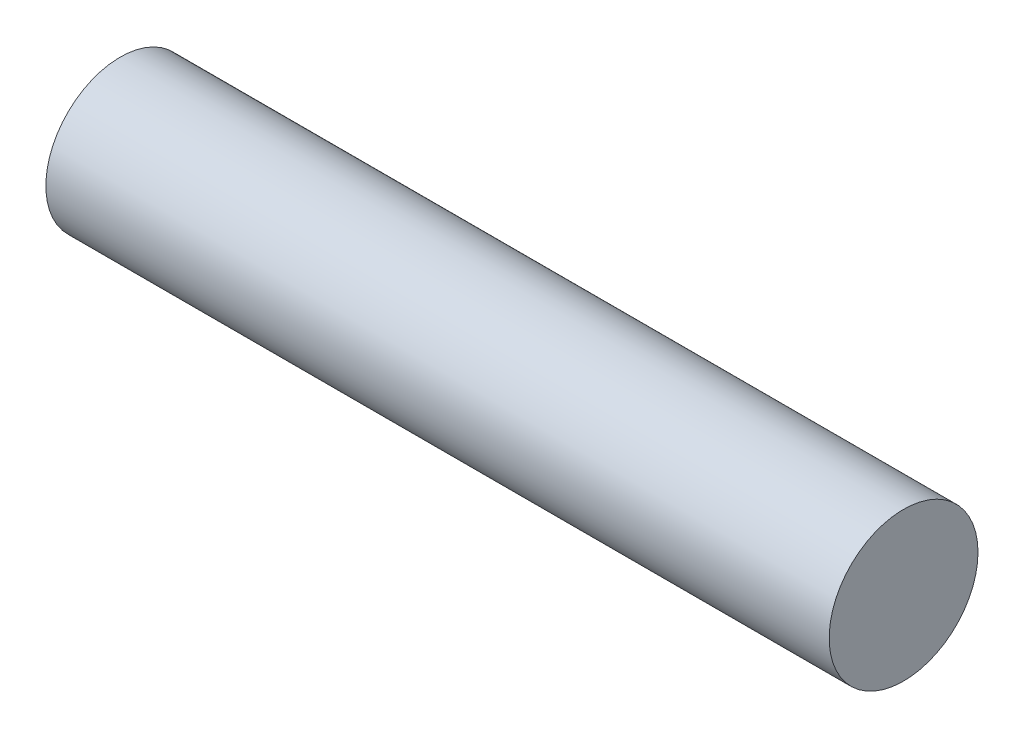
ISO-10303-21;
HEADER;
FILE_DESCRIPTION(('STEP AP214'),'2;1');
FILE_NAME('part.step','',(''),(''),'','','');
FILE_SCHEMA(('AUTOMOTIVE_DESIGN { 1 0 10303 214 1 1 1 1 }'));
ENDSEC;
DATA;
#1=APPLICATION_CONTEXT('core data for automotive mechanical design processes');
#2=APPLICATION_PROTOCOL_DEFINITION('international standard','automotive_design',2000,#1);
#3=PRODUCT_CONTEXT('',#1,'mechanical');
#4=PRODUCT('Part','Part','',(#3));
#5=PRODUCT_RELATED_PRODUCT_CATEGORY('part','',(#4));
#6=PRODUCT_DEFINITION_FORMATION('','',#4);
#7=PRODUCT_DEFINITION_CONTEXT('part definition',#1,'design');
#8=PRODUCT_DEFINITION('design','',#6,#7);
#9=PRODUCT_DEFINITION_SHAPE('','',#8);
#10=(LENGTH_UNIT() NAMED_UNIT(*) SI_UNIT(.MILLI.,.METRE.));
#11=(NAMED_UNIT(*) PLANE_ANGLE_UNIT() SI_UNIT($,.RADIAN.));
#12=(NAMED_UNIT(*) SI_UNIT($,.STERADIAN.) SOLID_ANGLE_UNIT());
#13=UNCERTAINTY_MEASURE_WITH_UNIT(LENGTH_MEASURE(1.E-05),#10,'distance_accuracy_value','');
#14=(GEOMETRIC_REPRESENTATION_CONTEXT(3) GLOBAL_UNCERTAINTY_ASSIGNED_CONTEXT((#13)) GLOBAL_UNIT_ASSIGNED_CONTEXT((#10,
#11,#12)) REPRESENTATION_CONTEXT('',''));
#15=CARTESIAN_POINT('',(0.,0.,0.));
#16=DIRECTION('',(0.,0.,1.));
#17=DIRECTION('',(1.,0.,0.));
#18=AXIS2_PLACEMENT_3D('',#15,#16,#17);
#19=CARTESIAN_POINT('',(58.,-9.,-28.));
#20=DIRECTION('',(-1.,0.,0.));
#21=DIRECTION('',(0.,0.,1.));
#22=AXIS2_PLACEMENT_3D('',#19,#20,#21);
#23=CYLINDRICAL_SURFACE('',#22,4.);
#24=CARTESIAN_POINT('',(58.,-9.,-28.));
#25=DIRECTION('',(1.,0.,0.));
#26=DIRECTION('',(0.,0.,-1.));
#27=AXIS2_PLACEMENT_3D('',#24,#25,#26);
#28=CIRCLE('',#27,4.);
#29=CARTESIAN_POINT('',(58.,-9.,-32.));
#30=VERTEX_POINT('',#29);
#31=EDGE_CURVE('E10',#30,#30,#28,.T.);
#32=ORIENTED_EDGE('',*,*,#31,.F.);
#33=EDGE_LOOP('',(#32));
#34=FACE_BOUND('',#33,.T.);
#35=CARTESIAN_POINT('',(15.9,-9.,-28.));
#36=DIRECTION('',(1.,0.,0.));
#37=DIRECTION('',(0.,0.,-1.));
#38=AXIS2_PLACEMENT_3D('',#35,#36,#37);
#39=CIRCLE('',#38,4.);
#40=CARTESIAN_POINT('',(15.9,-9.,-32.));
#41=VERTEX_POINT('',#40);
#42=EDGE_CURVE('E45',#41,#41,#39,.T.);
#43=ORIENTED_EDGE('',*,*,#42,.T.);
#44=EDGE_LOOP('',(#43));
#45=FACE_BOUND('',#44,.T.);
#46=ADVANCED_FACE('F39',(#34,#45),#23,.T.);
#47=CARTESIAN_POINT('',(58.,-9.,-28.));
#48=DIRECTION('',(1.,0.,0.));
#49=DIRECTION('',(0.,0.,-1.));
#50=AXIS2_PLACEMENT_3D('',#47,#48,#49);
#51=PLANE('',#50);
#52=ORIENTED_EDGE('',*,*,#31,.T.);
#53=EDGE_LOOP('',(#52));
#54=FACE_BOUND('',#53,.T.);
#55=ADVANCED_FACE('F53',(#54),#51,.T.);
#56=CARTESIAN_POINT('',(15.9,-9.,-28.));
#57=DIRECTION('',(1.,0.,0.));
#58=DIRECTION('',(0.,0.,-1.));
#59=AXIS2_PLACEMENT_3D('',#56,#57,#58);
#60=PLANE('',#59);
#61=ORIENTED_EDGE('',*,*,#42,.F.);
#62=EDGE_LOOP('',(#61));
#63=FACE_BOUND('',#62,.T.);
#64=ADVANCED_FACE('F55',(#63),#60,.F.);
#65=CLOSED_SHELL('',(#46,#55,#64));
#66=MANIFOLD_SOLID_BREP('B2',#65);
#67=ADVANCED_BREP_SHAPE_REPRESENTATION('',(#18,#66),#14);
#68=SHAPE_DEFINITION_REPRESENTATION(#9,#67);
ENDSEC;
END-ISO-10303-21;
